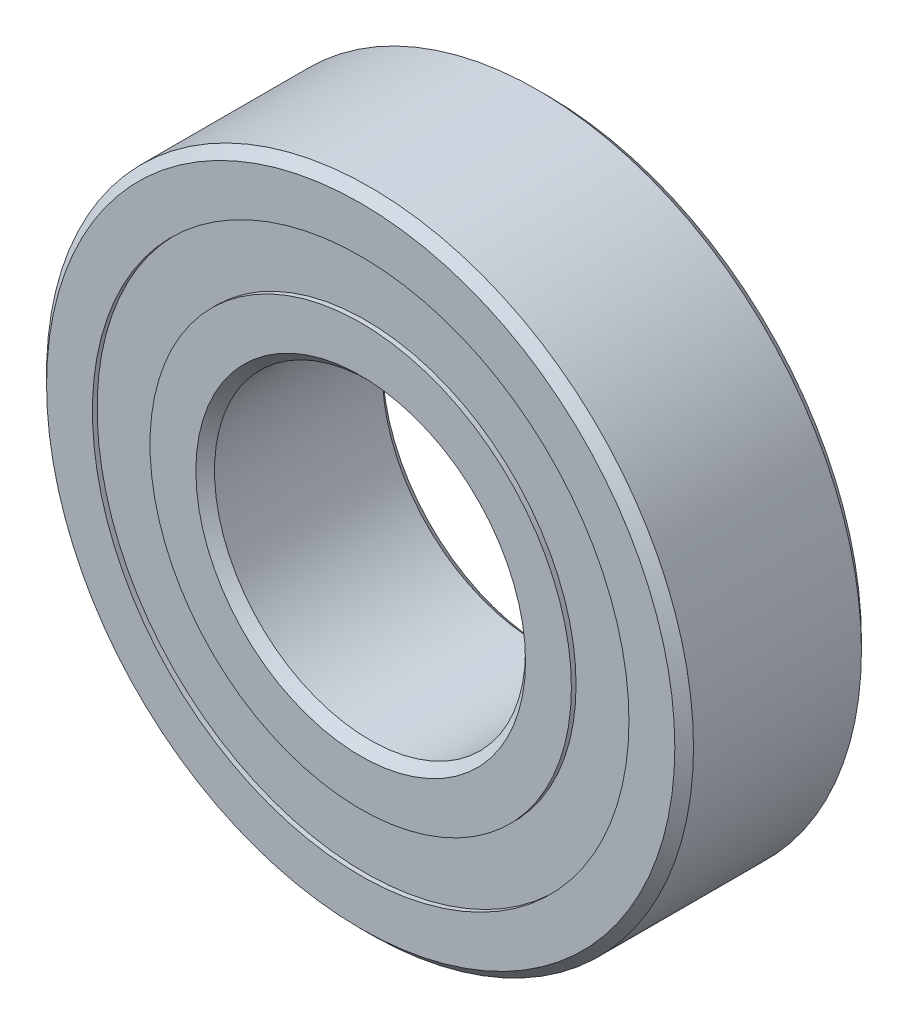
ISO-10303-21;
HEADER;
FILE_DESCRIPTION(('STEP AP214'),'2;1');
FILE_NAME('part.step','',(''),(''),'','','');
FILE_SCHEMA(('AUTOMOTIVE_DESIGN { 1 0 10303 214 1 1 1 1 }'));
ENDSEC;
DATA;
#1=APPLICATION_CONTEXT('core data for automotive mechanical design processes');
#2=APPLICATION_PROTOCOL_DEFINITION('international standard','automotive_design',2000,#1);
#3=PRODUCT_CONTEXT('',#1,'mechanical');
#4=PRODUCT('Part','Part','',(#3));
#5=PRODUCT_RELATED_PRODUCT_CATEGORY('part','',(#4));
#6=PRODUCT_DEFINITION_FORMATION('','',#4);
#7=PRODUCT_DEFINITION_CONTEXT('part definition',#1,'design');
#8=PRODUCT_DEFINITION('design','',#6,#7);
#9=PRODUCT_DEFINITION_SHAPE('','',#8);
#10=(LENGTH_UNIT() NAMED_UNIT(*) SI_UNIT(.MILLI.,.METRE.));
#11=(NAMED_UNIT(*) PLANE_ANGLE_UNIT() SI_UNIT($,.RADIAN.));
#12=(NAMED_UNIT(*) SI_UNIT($,.STERADIAN.) SOLID_ANGLE_UNIT());
#13=UNCERTAINTY_MEASURE_WITH_UNIT(LENGTH_MEASURE(1.E-05),#10,'distance_accuracy_value','');
#14=(GEOMETRIC_REPRESENTATION_CONTEXT(3) GLOBAL_UNCERTAINTY_ASSIGNED_CONTEXT((#13)) GLOBAL_UNIT_ASSIGNED_CONTEXT((#10,
#11,#12)) REPRESENTATION_CONTEXT('',''));
#15=CARTESIAN_POINT('',(0.,0.,0.));
#16=DIRECTION('',(0.,0.,1.));
#17=DIRECTION('',(1.,0.,0.));
#18=AXIS2_PLACEMENT_3D('',#15,#16,#17);
#19=CARTESIAN_POINT('',(0.,21.5625,-7.125));
#20=DIRECTION('',(0.,0.,1.));
#21=DIRECTION('',(1.,0.,0.));
#22=AXIS2_PLACEMENT_3D('',#19,#20,#21);
#23=PLANE('',#22);
#24=CARTESIAN_POINT('',(0.,0.,-7.125));
#25=DIRECTION('',(0.,0.,1.));
#26=DIRECTION('',(1.,0.,0.));
#27=AXIS2_PLACEMENT_3D('',#24,#25,#26);
#28=CIRCLE('',#27,21.5625);
#29=CARTESIAN_POINT('',(21.5625,0.,-7.125));
#30=VERTEX_POINT('',#29);
#31=EDGE_CURVE('E59',#30,#30,#28,.T.);
#32=ORIENTED_EDGE('',*,*,#31,.F.);
#33=EDGE_LOOP('',(#32));
#34=FACE_BOUND('',#33,.T.);
#35=CARTESIAN_POINT('',(0.,0.,-7.125));
#36=DIRECTION('',(0.,0.,1.));
#37=DIRECTION('',(1.,0.,0.));
#38=AXIS2_PLACEMENT_3D('',#35,#36,#37);
#39=CIRCLE('',#38,16.9375);
#40=CARTESIAN_POINT('',(16.9375,0.,-7.125));
#41=VERTEX_POINT('',#40);
#42=EDGE_CURVE('E11',#41,#41,#39,.T.);
#43=ORIENTED_EDGE('',*,*,#42,.T.);
#44=EDGE_LOOP('',(#43));
#45=FACE_BOUND('',#44,.T.);
#46=ADVANCED_FACE('F45',(#34,#45),#23,.F.);
#47=CARTESIAN_POINT('',(0.,0.,7.5));
#48=DIRECTION('',(0.,0.,1.));
#49=DIRECTION('',(1.,0.,0.));
#50=AXIS2_PLACEMENT_3D('',#47,#48,#49);
#51=CYLINDRICAL_SURFACE('',#50,16.9375);
#52=ORIENTED_EDGE('',*,*,#42,.F.);
#53=EDGE_LOOP('',(#52));
#54=FACE_BOUND('',#53,.T.);
#55=CARTESIAN_POINT('',(0.,0.,-4.05694064057032));
#56=DIRECTION('',(0.,0.,1.));
#57=DIRECTION('',(1.,0.,0.));
#58=AXIS2_PLACEMENT_3D('',#55,#56,#57);
#59=CIRCLE('',#58,16.9375);
#60=CARTESIAN_POINT('',(16.9375,0.,-4.05694064057032));
#61=VERTEX_POINT('',#60);
#62=EDGE_CURVE('E51',#61,#61,#59,.T.);
#63=ORIENTED_EDGE('',*,*,#62,.T.);
#64=EDGE_LOOP('',(#63));
#65=FACE_BOUND('',#64,.T.);
#66=ADVANCED_FACE('F68',(#54,#65),#51,.F.);
#67=CARTESIAN_POINT('',(0.,21.5625,-4.05694064057032));
#68=DIRECTION('',(0.,0.,-1.));
#69=DIRECTION('',(-1.,0.,0.));
#70=AXIS2_PLACEMENT_3D('',#67,#68,#69);
#71=PLANE('',#70);
#72=ORIENTED_EDGE('',*,*,#62,.F.);
#73=EDGE_LOOP('',(#72));
#74=FACE_BOUND('',#73,.T.);
#75=CARTESIAN_POINT('',(0.,0.,-4.05694064057032));
#76=DIRECTION('',(0.,0.,1.));
#77=DIRECTION('',(1.,0.,0.));
#78=AXIS2_PLACEMENT_3D('',#75,#76,#77);
#79=CIRCLE('',#78,21.5625);
#80=CARTESIAN_POINT('',(21.5625,0.,-4.05694064057032));
#81=VERTEX_POINT('',#80);
#82=EDGE_CURVE('E55',#81,#81,#79,.T.);
#83=ORIENTED_EDGE('',*,*,#82,.T.);
#84=EDGE_LOOP('',(#83));
#85=FACE_BOUND('',#84,.T.);
#86=ADVANCED_FACE('F72',(#74,#85),#71,.F.);
#87=CARTESIAN_POINT('',(0.,0.,7.5));
#88=DIRECTION('',(0.,0.,1.));
#89=DIRECTION('',(1.,0.,0.));
#90=AXIS2_PLACEMENT_3D('',#87,#88,#89);
#91=CYLINDRICAL_SURFACE('',#90,21.5625);
#92=ORIENTED_EDGE('',*,*,#82,.F.);
#93=EDGE_LOOP('',(#92));
#94=FACE_BOUND('',#93,.T.);
#95=ORIENTED_EDGE('',*,*,#31,.T.);
#96=EDGE_LOOP('',(#95));
#97=FACE_BOUND('',#96,.T.);
#98=ADVANCED_FACE('F65',(#94,#97),#91,.T.);
#99=CLOSED_SHELL('',(#46,#66,#86,#98));
#100=MANIFOLD_SOLID_BREP('B2',#99);
#101=CARTESIAN_POINT('',(0.,21.5625,7.125));
#102=DIRECTION('',(0.,0.,-1.));
#103=DIRECTION('',(-1.,0.,0.));
#104=AXIS2_PLACEMENT_3D('',#101,#102,#103);
#105=PLANE('',#104);
#106=CARTESIAN_POINT('',(0.,0.,7.125));
#107=DIRECTION('',(0.,0.,1.));
#108=DIRECTION('',(1.,0.,0.));
#109=AXIS2_PLACEMENT_3D('',#106,#107,#108);
#110=CIRCLE('',#109,16.9375);
#111=CARTESIAN_POINT('',(16.9375,0.,7.125));
#112=VERTEX_POINT('',#111);
#113=EDGE_CURVE('E44',#112,#112,#110,.T.);
#114=ORIENTED_EDGE('',*,*,#113,.F.);
#115=EDGE_LOOP('',(#114));
#116=FACE_BOUND('',#115,.T.);
#117=CARTESIAN_POINT('',(0.,0.,7.125));
#118=DIRECTION('',(0.,0.,1.));
#119=DIRECTION('',(1.,0.,0.));
#120=AXIS2_PLACEMENT_3D('',#117,#118,#119);
#121=CIRCLE('',#120,21.5625);
#122=CARTESIAN_POINT('',(21.5625,0.,7.125));
#123=VERTEX_POINT('',#122);
#124=EDGE_CURVE('E126',#123,#123,#121,.T.);
#125=ORIENTED_EDGE('',*,*,#124,.T.);
#126=EDGE_LOOP('',(#125));
#127=FACE_BOUND('',#126,.T.);
#128=ADVANCED_FACE('F112',(#116,#127),#105,.F.);
#129=CARTESIAN_POINT('',(0.,0.,7.5));
#130=DIRECTION('',(0.,0.,1.));
#131=DIRECTION('',(1.,0.,0.));
#132=AXIS2_PLACEMENT_3D('',#129,#130,#131);
#133=CYLINDRICAL_SURFACE('',#132,16.9375);
#134=CARTESIAN_POINT('',(0.,0.,4.05694064057032));
#135=DIRECTION('',(0.,0.,1.));
#136=DIRECTION('',(1.,0.,0.));
#137=AXIS2_PLACEMENT_3D('',#134,#135,#136);
#138=CIRCLE('',#137,16.9375);
#139=CARTESIAN_POINT('',(16.9375,0.,4.05694064057032));
#140=VERTEX_POINT('',#139);
#141=EDGE_CURVE('E118',#140,#140,#138,.T.);
#142=ORIENTED_EDGE('',*,*,#141,.F.);
#143=EDGE_LOOP('',(#142));
#144=FACE_BOUND('',#143,.T.);
#145=ORIENTED_EDGE('',*,*,#113,.T.);
#146=EDGE_LOOP('',(#145));
#147=FACE_BOUND('',#146,.T.);
#148=ADVANCED_FACE('F141',(#144,#147),#133,.F.);
#149=CARTESIAN_POINT('',(0.,21.5625,4.05694064057032));
#150=DIRECTION('',(0.,0.,1.));
#151=DIRECTION('',(1.,0.,0.));
#152=AXIS2_PLACEMENT_3D('',#149,#150,#151);
#153=PLANE('',#152);
#154=CARTESIAN_POINT('',(0.,0.,4.05694064057032));
#155=DIRECTION('',(0.,0.,1.));
#156=DIRECTION('',(1.,0.,0.));
#157=AXIS2_PLACEMENT_3D('',#154,#155,#156);
#158=CIRCLE('',#157,21.5625);
#159=CARTESIAN_POINT('',(21.5625,0.,4.05694064057032));
#160=VERTEX_POINT('',#159);
#161=EDGE_CURVE('E122',#160,#160,#158,.T.);
#162=ORIENTED_EDGE('',*,*,#161,.F.);
#163=EDGE_LOOP('',(#162));
#164=FACE_BOUND('',#163,.T.);
#165=ORIENTED_EDGE('',*,*,#141,.T.);
#166=EDGE_LOOP('',(#165));
#167=FACE_BOUND('',#166,.T.);
#168=ADVANCED_FACE('F136',(#164,#167),#153,.F.);
#169=CARTESIAN_POINT('',(0.,0.,7.5));
#170=DIRECTION('',(0.,0.,1.));
#171=DIRECTION('',(1.,0.,0.));
#172=AXIS2_PLACEMENT_3D('',#169,#170,#171);
#173=CYLINDRICAL_SURFACE('',#172,21.5625);
#174=ORIENTED_EDGE('',*,*,#124,.F.);
#175=EDGE_LOOP('',(#174));
#176=FACE_BOUND('',#175,.T.);
#177=ORIENTED_EDGE('',*,*,#161,.T.);
#178=EDGE_LOOP('',(#177));
#179=FACE_BOUND('',#178,.T.);
#180=ADVANCED_FACE('F133',(#176,#179),#173,.T.);
#181=CLOSED_SHELL('',(#128,#148,#168,#180));
#182=MANIFOLD_SOLID_BREP('B6',#181);
#183=CARTESIAN_POINT('',(-11.3148661066299,15.5735771417179,0.));
#184=DIRECTION('',(0.,0.,1.));
#185=DIRECTION('',(-0.587785252292462,0.809016994374955,0.));
#186=AXIS2_PLACEMENT_3D('',#183,#184,#185);
#187=SPHERICAL_SURFACE('',#186,4.05694064057032);
#188=CARTESIAN_POINT('',(-11.3148661066299,15.5735771417179,4.05694064057032));
#189=VERTEX_POINT('',#188);
#190=VERTEX_LOOP('',#189);
#191=FACE_BOUND('',#190,.T.);
#192=ADVANCED_FACE('F179',(#191),#187,.T.);
#193=CLOSED_SHELL('',(#192));
#194=MANIFOLD_SOLID_BREP('B39',#193);
#195=CARTESIAN_POINT('',(-18.3078379386816,5.94857714171795,0.));
#196=DIRECTION('',(0.,0.,1.));
#197=DIRECTION('',(-0.95105651629515,0.309016994374958,0.));
#198=AXIS2_PLACEMENT_3D('',#195,#196,#197);
#199=SPHERICAL_SURFACE('',#198,4.05694064057032);
#200=CARTESIAN_POINT('',(-18.3078379386816,5.94857714171795,4.05694064057032));
#201=VERTEX_POINT('',#200);
#202=VERTEX_LOOP('',#201);
#203=FACE_BOUND('',#202,.T.);
#204=ADVANCED_FACE('F199',(#203),#199,.T.);
#205=CLOSED_SHELL('',(#204));
#206=MANIFOLD_SOLID_BREP('B108',#205);
#207=CARTESIAN_POINT('',(-18.3078379386818,-5.94857714171756,0.));
#208=DIRECTION('',(0.,0.,1.));
#209=DIRECTION('',(-0.951056516295157,-0.309016994374938,0.));
#210=AXIS2_PLACEMENT_3D('',#207,#208,#209);
#211=SPHERICAL_SURFACE('',#210,4.05694064057032);
#212=CARTESIAN_POINT('',(-18.3078379386818,-5.94857714171756,4.05694064057032));
#213=VERTEX_POINT('',#212);
#214=VERTEX_LOOP('',#213);
#215=FACE_BOUND('',#214,.T.);
#216=ADVANCED_FACE('F219',(#215),#211,.T.);
#217=CLOSED_SHELL('',(#216));
#218=MANIFOLD_SOLID_BREP('B175',#217);
#219=CARTESIAN_POINT('',(-11.3148661066302,-15.5735771417176,0.));
#220=DIRECTION('',(0.,0.,1.));
#221=DIRECTION('',(-0.58778525229248,-0.809016994374942,0.));
#222=AXIS2_PLACEMENT_3D('',#219,#220,#221);
#223=SPHERICAL_SURFACE('',#222,4.05694064057032);
#224=CARTESIAN_POINT('',(-11.3148661066302,-15.5735771417176,4.05694064057032));
#225=VERTEX_POINT('',#224);
#226=VERTEX_LOOP('',#225);
#227=FACE_BOUND('',#226,.T.);
#228=ADVANCED_FACE('F239',(#227),#223,.T.);
#229=CLOSED_SHELL('',(#228));
#230=MANIFOLD_SOLID_BREP('B195',#229);
#231=CARTESIAN_POINT('',(-1.34422031545461E-13,-19.25,0.));
#232=DIRECTION('',(0.,0.,1.));
#233=DIRECTION('',(0.,-1.,0.));
#234=AXIS2_PLACEMENT_3D('',#231,#232,#233);
#235=SPHERICAL_SURFACE('',#234,4.05694064057032);
#236=CARTESIAN_POINT('',(-1.34422031545461E-13,-19.25,4.05694064057032));
#237=VERTEX_POINT('',#236);
#238=VERTEX_LOOP('',#237);
#239=FACE_BOUND('',#238,.T.);
#240=ADVANCED_FACE('F259',(#239),#235,.T.);
#241=CLOSED_SHELL('',(#240));
#242=MANIFOLD_SOLID_BREP('B215',#241);
#243=CARTESIAN_POINT('',(11.31486610663,-15.5735771417178,0.));
#244=DIRECTION('',(0.,0.,1.));
#245=DIRECTION('',(0.587785252292469,-0.809016994374951,0.));
#246=AXIS2_PLACEMENT_3D('',#243,#244,#245);
#247=SPHERICAL_SURFACE('',#246,4.05694064057032);
#248=CARTESIAN_POINT('',(11.31486610663,-15.5735771417178,4.05694064057032));
#249=VERTEX_POINT('',#248);
#250=VERTEX_LOOP('',#249);
#251=FACE_BOUND('',#250,.T.);
#252=ADVANCED_FACE('F279',(#251),#247,.T.);
#253=CLOSED_SHELL('',(#252));
#254=MANIFOLD_SOLID_BREP('B235',#253);
#255=CARTESIAN_POINT('',(18.3078379386817,-5.94857714171782,0.));
#256=DIRECTION('',(0.,0.,1.));
#257=DIRECTION('',(0.951056516295152,-0.309016994374952,0.));
#258=AXIS2_PLACEMENT_3D('',#255,#256,#257);
#259=SPHERICAL_SURFACE('',#258,4.05694064057032);
#260=CARTESIAN_POINT('',(18.3078379386817,-5.94857714171782,4.05694064057032));
#261=VERTEX_POINT('',#260);
#262=VERTEX_LOOP('',#261);
#263=FACE_BOUND('',#262,.T.);
#264=ADVANCED_FACE('F299',(#263),#259,.T.);
#265=CLOSED_SHELL('',(#264));
#266=MANIFOLD_SOLID_BREP('B255',#265);
#267=CARTESIAN_POINT('',(18.3078379386817,5.94857714171769,0.));
#268=DIRECTION('',(0.,0.,1.));
#269=DIRECTION('',(0.951056516295155,0.309016994374945,0.));
#270=AXIS2_PLACEMENT_3D('',#267,#268,#269);
#271=SPHERICAL_SURFACE('',#270,4.05694064057032);
#272=CARTESIAN_POINT('',(18.3078379386817,5.94857714171769,4.05694064057032));
#273=VERTEX_POINT('',#272);
#274=VERTEX_LOOP('',#273);
#275=FACE_BOUND('',#274,.T.);
#276=ADVANCED_FACE('F319',(#275),#271,.T.);
#277=CLOSED_SHELL('',(#276));
#278=MANIFOLD_SOLID_BREP('B275',#277);
#279=CARTESIAN_POINT('',(11.3148661066301,15.5735771417177,0.));
#280=DIRECTION('',(0.,0.,1.));
#281=DIRECTION('',(0.587785252292474,0.809016994374947,0.));
#282=AXIS2_PLACEMENT_3D('',#279,#280,#281);
#283=SPHERICAL_SURFACE('',#282,4.05694064057032);
#284=CARTESIAN_POINT('',(11.3148661066301,15.5735771417177,4.05694064057032));
#285=VERTEX_POINT('',#284);
#286=VERTEX_LOOP('',#285);
#287=FACE_BOUND('',#286,.T.);
#288=ADVANCED_FACE('F339',(#287),#283,.T.);
#289=CLOSED_SHELL('',(#288));
#290=MANIFOLD_SOLID_BREP('B295',#289);
#291=CARTESIAN_POINT('',(0.,19.25,0.));
#292=DIRECTION('',(0.,0.,1.));
#293=DIRECTION('',(0.,1.,0.));
#294=AXIS2_PLACEMENT_3D('',#291,#292,#293);
#295=SPHERICAL_SURFACE('',#294,4.05694064057032);
#296=CARTESIAN_POINT('',(0.,19.25,4.05694064057032));
#297=VERTEX_POINT('',#296);
#298=VERTEX_LOOP('',#297);
#299=FACE_BOUND('',#298,.T.);
#300=ADVANCED_FACE('F361',(#299),#295,.T.);
#301=CLOSED_SHELL('',(#300));
#302=MANIFOLD_SOLID_BREP('B315',#301);
#303=CARTESIAN_POINT('',(0.,0.,7.5));
#304=DIRECTION('',(0.,0.,1.));
#305=DIRECTION('',(1.,0.,0.));
#306=AXIS2_PLACEMENT_3D('',#303,#304,#305);
#307=CONICAL_SURFACE('',#306,13.25,0.785398163397448);
#308=CARTESIAN_POINT('',(0.,0.,6.75));
#309=DIRECTION('',(0.,0.,1.));
#310=DIRECTION('',(1.,0.,0.));
#311=AXIS2_PLACEMENT_3D('',#308,#309,#310);
#312=CIRCLE('',#311,12.5);
#313=CARTESIAN_POINT('',(12.5,0.,6.75));
#314=VERTEX_POINT('',#313);
#315=EDGE_CURVE('E360',#314,#314,#312,.T.);
#316=ORIENTED_EDGE('',*,*,#315,.F.);
#317=EDGE_LOOP('',(#316));
#318=FACE_BOUND('',#317,.T.);
#319=CARTESIAN_POINT('',(0.,0.,7.5));
#320=DIRECTION('',(0.,0.,1.));
#321=DIRECTION('',(1.,0.,0.));
#322=AXIS2_PLACEMENT_3D('',#319,#320,#321);
#323=CIRCLE('',#322,13.25);
#324=CARTESIAN_POINT('',(13.25,0.,7.5));
#325=VERTEX_POINT('',#324);
#326=EDGE_CURVE('E408',#325,#325,#323,.T.);
#327=ORIENTED_EDGE('',*,*,#326,.T.);
#328=EDGE_LOOP('',(#327));
#329=FACE_BOUND('',#328,.T.);
#330=ADVANCED_FACE('F380',(#318,#329),#307,.F.);
#331=CARTESIAN_POINT('',(0.,0.,7.5));
#332=DIRECTION('',(0.,0.,1.));
#333=DIRECTION('',(1.,0.,0.));
#334=AXIS2_PLACEMENT_3D('',#331,#332,#333);
#335=CYLINDRICAL_SURFACE('',#334,12.5);
#336=CARTESIAN_POINT('',(0.,0.,-6.75));
#337=DIRECTION('',(0.,0.,1.));
#338=DIRECTION('',(1.,0.,0.));
#339=AXIS2_PLACEMENT_3D('',#336,#337,#338);
#340=CIRCLE('',#339,12.5);
#341=CARTESIAN_POINT('',(12.5,0.,-6.75));
#342=VERTEX_POINT('',#341);
#343=EDGE_CURVE('E386',#342,#342,#340,.T.);
#344=ORIENTED_EDGE('',*,*,#343,.F.);
#345=EDGE_LOOP('',(#344));
#346=FACE_BOUND('',#345,.T.);
#347=ORIENTED_EDGE('',*,*,#315,.T.);
#348=EDGE_LOOP('',(#347));
#349=FACE_BOUND('',#348,.T.);
#350=ADVANCED_FACE('F445',(#346,#349),#335,.F.);
#351=CARTESIAN_POINT('',(0.,0.,-6.75));
#352=DIRECTION('',(0.,0.,-1.));
#353=DIRECTION('',(-1.,0.,0.));
#354=AXIS2_PLACEMENT_3D('',#351,#352,#353);
#355=CONICAL_SURFACE('',#354,12.5,0.785398163397448);
#356=CARTESIAN_POINT('',(0.,0.,-7.5));
#357=DIRECTION('',(0.,0.,1.));
#358=DIRECTION('',(1.,0.,0.));
#359=AXIS2_PLACEMENT_3D('',#356,#357,#358);
#360=CIRCLE('',#359,13.25);
#361=CARTESIAN_POINT('',(13.25,0.,-7.5));
#362=VERTEX_POINT('',#361);
#363=EDGE_CURVE('E390',#362,#362,#360,.T.);
#364=ORIENTED_EDGE('',*,*,#363,.F.);
#365=EDGE_LOOP('',(#364));
#366=FACE_BOUND('',#365,.T.);
#367=ORIENTED_EDGE('',*,*,#343,.T.);
#368=EDGE_LOOP('',(#367));
#369=FACE_BOUND('',#368,.T.);
#370=ADVANCED_FACE('F440',(#366,#369),#355,.F.);
#371=CARTESIAN_POINT('',(0.,13.25,-7.5));
#372=DIRECTION('',(0.,0.,1.));
#373=DIRECTION('',(1.,0.,0.));
#374=AXIS2_PLACEMENT_3D('',#371,#372,#373);
#375=PLANE('',#374);
#376=CARTESIAN_POINT('',(0.,0.,-7.5));
#377=DIRECTION('',(0.,0.,1.));
#378=DIRECTION('',(1.,0.,0.));
#379=AXIS2_PLACEMENT_3D('',#376,#377,#378);
#380=CIRCLE('',#379,16.9375);
#381=CARTESIAN_POINT('',(16.9375,0.,-7.5));
#382=VERTEX_POINT('',#381);
#383=EDGE_CURVE('E394',#382,#382,#380,.T.);
#384=ORIENTED_EDGE('',*,*,#383,.F.);
#385=EDGE_LOOP('',(#384));
#386=FACE_BOUND('',#385,.T.);
#387=ORIENTED_EDGE('',*,*,#363,.T.);
#388=EDGE_LOOP('',(#387));
#389=FACE_BOUND('',#388,.T.);
#390=ADVANCED_FACE('F434',(#386,#389),#375,.F.);
#391=CARTESIAN_POINT('',(0.,0.,7.5));
#392=DIRECTION('',(0.,0.,1.));
#393=DIRECTION('',(1.,0.,0.));
#394=AXIS2_PLACEMENT_3D('',#391,#392,#393);
#395=CYLINDRICAL_SURFACE('',#394,16.9375);
#396=CARTESIAN_POINT('',(0.,0.,-3.33333333333333));
#397=DIRECTION('',(0.,0.,1.));
#398=DIRECTION('',(1.,0.,0.));
#399=AXIS2_PLACEMENT_3D('',#396,#397,#398);
#400=CIRCLE('',#399,16.9375);
#401=CARTESIAN_POINT('',(16.9375,0.,-3.33333333333333));
#402=VERTEX_POINT('',#401);
#403=EDGE_CURVE('E399',#402,#402,#400,.T.);
#404=ORIENTED_EDGE('',*,*,#403,.F.);
#405=EDGE_LOOP('',(#404));
#406=FACE_BOUND('',#405,.T.);
#407=ORIENTED_EDGE('',*,*,#383,.T.);
#408=EDGE_LOOP('',(#407));
#409=FACE_BOUND('',#408,.T.);
#410=ADVANCED_FACE('F428',(#406,#409),#395,.T.);
#411=CARTESIAN_POINT('',(0.,0.,0.));
#412=DIRECTION('',(0.,0.,1.));
#413=DIRECTION('',(1.,0.,0.));
#414=AXIS2_PLACEMENT_3D('',#411,#412,#413);
#415=TOROIDAL_SURFACE('',#414,19.25,4.05694064057032);
#416=CARTESIAN_POINT('',(0.,0.,3.33333333333333));
#417=DIRECTION('',(0.,0.,1.));
#418=DIRECTION('',(1.,0.,0.));
#419=AXIS2_PLACEMENT_3D('',#416,#417,#418);
#420=CIRCLE('',#419,16.9375);
#421=CARTESIAN_POINT('',(16.9375,0.,3.33333333333333));
#422=VERTEX_POINT('',#421);
#423=EDGE_CURVE('E402',#422,#422,#420,.T.);
#424=ORIENTED_EDGE('',*,*,#423,.F.);
#425=EDGE_LOOP('',(#424));
#426=FACE_BOUND('',#425,.T.);
#427=ORIENTED_EDGE('',*,*,#403,.T.);
#428=EDGE_LOOP('',(#427));
#429=FACE_BOUND('',#428,.T.);
#430=ADVANCED_FACE('F422',(#426,#429),#415,.F.);
#431=CARTESIAN_POINT('',(0.,0.,7.5));
#432=DIRECTION('',(0.,0.,1.));
#433=DIRECTION('',(1.,0.,0.));
#434=AXIS2_PLACEMENT_3D('',#431,#432,#433);
#435=CYLINDRICAL_SURFACE('',#434,16.9375);
#436=CARTESIAN_POINT('',(0.,0.,7.5));
#437=DIRECTION('',(0.,0.,1.));
#438=DIRECTION('',(1.,0.,0.));
#439=AXIS2_PLACEMENT_3D('',#436,#437,#438);
#440=CIRCLE('',#439,16.9375);
#441=CARTESIAN_POINT('',(16.9375,0.,7.5));
#442=VERTEX_POINT('',#441);
#443=EDGE_CURVE('E405',#442,#442,#440,.T.);
#444=ORIENTED_EDGE('',*,*,#443,.F.);
#445=EDGE_LOOP('',(#444));
#446=FACE_BOUND('',#445,.T.);
#447=ORIENTED_EDGE('',*,*,#423,.T.);
#448=EDGE_LOOP('',(#447));
#449=FACE_BOUND('',#448,.T.);
#450=ADVANCED_FACE('F416',(#446,#449),#435,.T.);
#451=CARTESIAN_POINT('',(0.,13.25,7.5));
#452=DIRECTION('',(0.,0.,-1.));
#453=DIRECTION('',(-1.,0.,0.));
#454=AXIS2_PLACEMENT_3D('',#451,#452,#453);
#455=PLANE('',#454);
#456=ORIENTED_EDGE('',*,*,#326,.F.);
#457=EDGE_LOOP('',(#456));
#458=FACE_BOUND('',#457,.T.);
#459=ORIENTED_EDGE('',*,*,#443,.T.);
#460=EDGE_LOOP('',(#459));
#461=FACE_BOUND('',#460,.T.);
#462=ADVANCED_FACE('F413',(#458,#461),#455,.F.);
#463=CLOSED_SHELL('',(#330,#350,#370,#390,#410,#430,#450,#462));
#464=MANIFOLD_SOLID_BREP('B335',#463);
#465=CARTESIAN_POINT('',(0.,0.,6.75));
#466=DIRECTION('',(0.,0.,-1.));
#467=DIRECTION('',(-1.,0.,0.));
#468=AXIS2_PLACEMENT_3D('',#465,#466,#467);
#469=CONICAL_SURFACE('',#468,26.,0.78539816339745);
#470=CARTESIAN_POINT('',(0.,0.,7.5));
#471=DIRECTION('',(0.,0.,1.));
#472=DIRECTION('',(1.,0.,0.));
#473=AXIS2_PLACEMENT_3D('',#470,#471,#472);
#474=CIRCLE('',#473,25.25);
#475=CARTESIAN_POINT('',(25.25,0.,7.5));
#476=VERTEX_POINT('',#475);
#477=EDGE_CURVE('E379',#476,#476,#474,.T.);
#478=ORIENTED_EDGE('',*,*,#477,.F.);
#479=EDGE_LOOP('',(#478));
#480=FACE_BOUND('',#479,.T.);
#481=CARTESIAN_POINT('',(0.,0.,6.75));
#482=DIRECTION('',(0.,0.,1.));
#483=DIRECTION('',(1.,0.,0.));
#484=AXIS2_PLACEMENT_3D('',#481,#482,#483);
#485=CIRCLE('',#484,26.);
#486=CARTESIAN_POINT('',(26.,0.,6.75));
#487=VERTEX_POINT('',#486);
#488=EDGE_CURVE('E529',#487,#487,#485,.T.);
#489=ORIENTED_EDGE('',*,*,#488,.T.);
#490=EDGE_LOOP('',(#489));
#491=FACE_BOUND('',#490,.T.);
#492=ADVANCED_FACE('F501',(#480,#491),#469,.T.);
#493=CARTESIAN_POINT('',(0.,25.25,7.5));
#494=DIRECTION('',(0.,0.,-1.));
#495=DIRECTION('',(-1.,0.,0.));
#496=AXIS2_PLACEMENT_3D('',#493,#494,#495);
#497=PLANE('',#496);
#498=CARTESIAN_POINT('',(0.,0.,7.5));
#499=DIRECTION('',(0.,0.,1.));
#500=DIRECTION('',(1.,0.,0.));
#501=AXIS2_PLACEMENT_3D('',#498,#499,#500);
#502=CIRCLE('',#501,21.5625);
#503=CARTESIAN_POINT('',(21.5625,0.,7.5));
#504=VERTEX_POINT('',#503);
#505=EDGE_CURVE('E507',#504,#504,#502,.T.);
#506=ORIENTED_EDGE('',*,*,#505,.F.);
#507=EDGE_LOOP('',(#506));
#508=FACE_BOUND('',#507,.T.);
#509=ORIENTED_EDGE('',*,*,#477,.T.);
#510=EDGE_LOOP('',(#509));
#511=FACE_BOUND('',#510,.T.);
#512=ADVANCED_FACE('F566',(#508,#511),#497,.F.);
#513=CARTESIAN_POINT('',(0.,0.,7.5));
#514=DIRECTION('',(0.,0.,1.));
#515=DIRECTION('',(1.,0.,0.));
#516=AXIS2_PLACEMENT_3D('',#513,#514,#515);
#517=CYLINDRICAL_SURFACE('',#516,21.5625);
#518=CARTESIAN_POINT('',(0.,0.,3.33333333333333));
#519=DIRECTION('',(0.,0.,1.));
#520=DIRECTION('',(1.,0.,0.));
#521=AXIS2_PLACEMENT_3D('',#518,#519,#520);
#522=CIRCLE('',#521,21.5625);
#523=CARTESIAN_POINT('',(21.5625,0.,3.33333333333333));
#524=VERTEX_POINT('',#523);
#525=EDGE_CURVE('E511',#524,#524,#522,.T.);
#526=ORIENTED_EDGE('',*,*,#525,.F.);
#527=EDGE_LOOP('',(#526));
#528=FACE_BOUND('',#527,.T.);
#529=ORIENTED_EDGE('',*,*,#505,.T.);
#530=EDGE_LOOP('',(#529));
#531=FACE_BOUND('',#530,.T.);
#532=ADVANCED_FACE('F561',(#528,#531),#517,.F.);
#533=CARTESIAN_POINT('',(0.,0.,0.));
#534=DIRECTION('',(0.,0.,1.));
#535=DIRECTION('',(1.,0.,0.));
#536=AXIS2_PLACEMENT_3D('',#533,#534,#535);
#537=TOROIDAL_SURFACE('',#536,19.25,4.05694064057032);
#538=CARTESIAN_POINT('',(0.,0.,-3.33333333333333));
#539=DIRECTION('',(0.,0.,1.));
#540=DIRECTION('',(1.,0.,0.));
#541=AXIS2_PLACEMENT_3D('',#538,#539,#540);
#542=CIRCLE('',#541,21.5625);
#543=CARTESIAN_POINT('',(21.5625,0.,-3.33333333333333));
#544=VERTEX_POINT('',#543);
#545=EDGE_CURVE('E515',#544,#544,#542,.T.);
#546=ORIENTED_EDGE('',*,*,#545,.F.);
#547=EDGE_LOOP('',(#546));
#548=FACE_BOUND('',#547,.T.);
#549=ORIENTED_EDGE('',*,*,#525,.T.);
#550=EDGE_LOOP('',(#549));
#551=FACE_BOUND('',#550,.T.);
#552=ADVANCED_FACE('F555',(#548,#551),#537,.F.);
#553=CARTESIAN_POINT('',(0.,0.,7.5));
#554=DIRECTION('',(0.,0.,1.));
#555=DIRECTION('',(1.,0.,0.));
#556=AXIS2_PLACEMENT_3D('',#553,#554,#555);
#557=CYLINDRICAL_SURFACE('',#556,21.5625);
#558=CARTESIAN_POINT('',(0.,0.,-7.5));
#559=DIRECTION('',(0.,0.,1.));
#560=DIRECTION('',(1.,0.,0.));
#561=AXIS2_PLACEMENT_3D('',#558,#559,#560);
#562=CIRCLE('',#561,21.5625);
#563=CARTESIAN_POINT('',(21.5625,0.,-7.5));
#564=VERTEX_POINT('',#563);
#565=EDGE_CURVE('E520',#564,#564,#562,.T.);
#566=ORIENTED_EDGE('',*,*,#565,.F.);
#567=EDGE_LOOP('',(#566));
#568=FACE_BOUND('',#567,.T.);
#569=ORIENTED_EDGE('',*,*,#545,.T.);
#570=EDGE_LOOP('',(#569));
#571=FACE_BOUND('',#570,.T.);
#572=ADVANCED_FACE('F549',(#568,#571),#557,.F.);
#573=CARTESIAN_POINT('',(0.,25.25,-7.5));
#574=DIRECTION('',(0.,0.,1.));
#575=DIRECTION('',(1.,0.,0.));
#576=AXIS2_PLACEMENT_3D('',#573,#574,#575);
#577=PLANE('',#576);
#578=CARTESIAN_POINT('',(0.,0.,-7.5));
#579=DIRECTION('',(0.,0.,1.));
#580=DIRECTION('',(1.,0.,0.));
#581=AXIS2_PLACEMENT_3D('',#578,#579,#580);
#582=CIRCLE('',#581,25.25);
#583=CARTESIAN_POINT('',(25.25,0.,-7.5));
#584=VERTEX_POINT('',#583);
#585=EDGE_CURVE('E523',#584,#584,#582,.T.);
#586=ORIENTED_EDGE('',*,*,#585,.F.);
#587=EDGE_LOOP('',(#586));
#588=FACE_BOUND('',#587,.T.);
#589=ORIENTED_EDGE('',*,*,#565,.T.);
#590=EDGE_LOOP('',(#589));
#591=FACE_BOUND('',#590,.T.);
#592=ADVANCED_FACE('F543',(#588,#591),#577,.F.);
#593=CARTESIAN_POINT('',(0.,0.,-7.5));
#594=DIRECTION('',(0.,0.,1.));
#595=DIRECTION('',(1.,0.,0.));
#596=AXIS2_PLACEMENT_3D('',#593,#594,#595);
#597=CONICAL_SURFACE('',#596,25.25,0.78539816339745);
#598=CARTESIAN_POINT('',(0.,0.,-6.75));
#599=DIRECTION('',(0.,0.,1.));
#600=DIRECTION('',(1.,0.,0.));
#601=AXIS2_PLACEMENT_3D('',#598,#599,#600);
#602=CIRCLE('',#601,26.);
#603=CARTESIAN_POINT('',(26.,0.,-6.75));
#604=VERTEX_POINT('',#603);
#605=EDGE_CURVE('E526',#604,#604,#602,.T.);
#606=ORIENTED_EDGE('',*,*,#605,.F.);
#607=EDGE_LOOP('',(#606));
#608=FACE_BOUND('',#607,.T.);
#609=ORIENTED_EDGE('',*,*,#585,.T.);
#610=EDGE_LOOP('',(#609));
#611=FACE_BOUND('',#610,.T.);
#612=ADVANCED_FACE('F537',(#608,#611),#597,.T.);
#613=CARTESIAN_POINT('',(0.,0.,7.5));
#614=DIRECTION('',(0.,0.,1.));
#615=DIRECTION('',(1.,0.,0.));
#616=AXIS2_PLACEMENT_3D('',#613,#614,#615);
#617=CYLINDRICAL_SURFACE('',#616,26.);
#618=ORIENTED_EDGE('',*,*,#488,.F.);
#619=EDGE_LOOP('',(#618));
#620=FACE_BOUND('',#619,.T.);
#621=ORIENTED_EDGE('',*,*,#605,.T.);
#622=EDGE_LOOP('',(#621));
#623=FACE_BOUND('',#622,.T.);
#624=ADVANCED_FACE('F534',(#620,#623),#617,.T.);
#625=CLOSED_SHELL('',(#492,#512,#532,#552,#572,#592,#612,#624));
#626=MANIFOLD_SOLID_BREP('B355',#625);
#627=ADVANCED_BREP_SHAPE_REPRESENTATION('',(#18,#100,#182,#194,#206,#218,#230,#242,#254,#266,
#278,#290,#302,#464,#626),#14);
#628=SHAPE_DEFINITION_REPRESENTATION(#9,#627);
ENDSEC;
END-ISO-10303-21;
